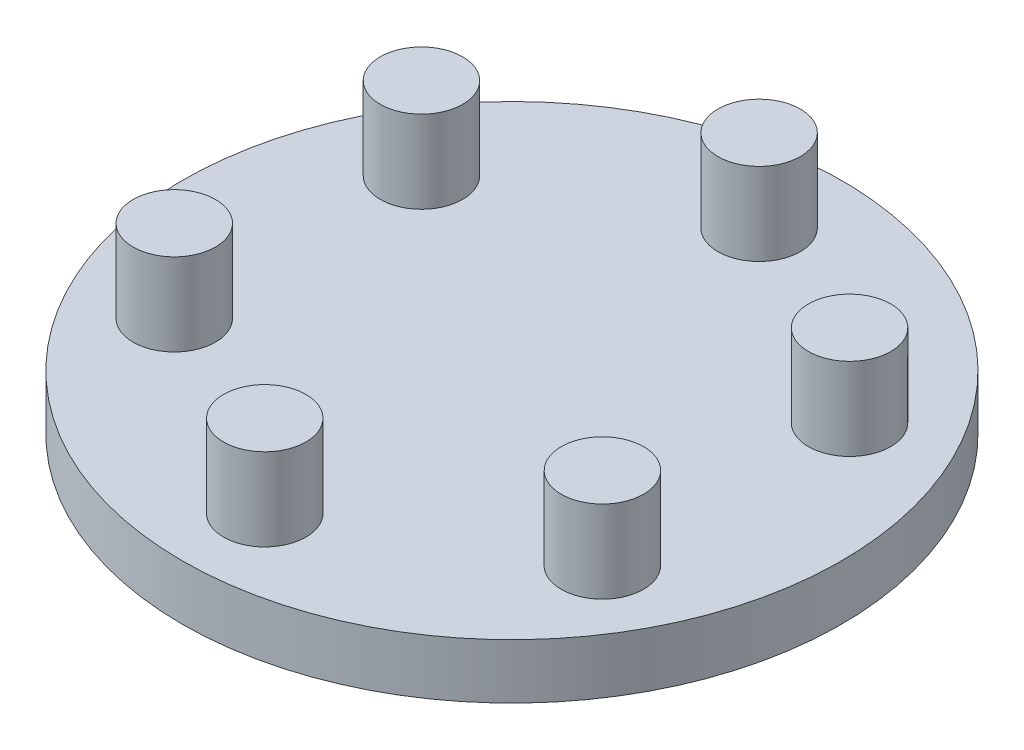
ISO-10303-21;
HEADER;
FILE_DESCRIPTION(('STEP AP214'),'2;1');
FILE_NAME('part.step','',(''),(''),'','','');
FILE_SCHEMA(('AUTOMOTIVE_DESIGN { 1 0 10303 214 1 1 1 1 }'));
ENDSEC;
DATA;
#1=APPLICATION_CONTEXT('core data for automotive mechanical design processes');
#2=APPLICATION_PROTOCOL_DEFINITION('international standard','automotive_design',2000,#1);
#3=PRODUCT_CONTEXT('',#1,'mechanical');
#4=PRODUCT('Part','Part','',(#3));
#5=PRODUCT_RELATED_PRODUCT_CATEGORY('part','',(#4));
#6=PRODUCT_DEFINITION_FORMATION('','',#4);
#7=PRODUCT_DEFINITION_CONTEXT('part definition',#1,'design');
#8=PRODUCT_DEFINITION('design','',#6,#7);
#9=PRODUCT_DEFINITION_SHAPE('','',#8);
#10=(LENGTH_UNIT() NAMED_UNIT(*) SI_UNIT(.MILLI.,.METRE.));
#11=(NAMED_UNIT(*) PLANE_ANGLE_UNIT() SI_UNIT($,.RADIAN.));
#12=(NAMED_UNIT(*) SI_UNIT($,.STERADIAN.) SOLID_ANGLE_UNIT());
#13=UNCERTAINTY_MEASURE_WITH_UNIT(LENGTH_MEASURE(1.E-05),#10,'distance_accuracy_value','');
#14=(GEOMETRIC_REPRESENTATION_CONTEXT(3) GLOBAL_UNCERTAINTY_ASSIGNED_CONTEXT((#13)) GLOBAL_UNIT_ASSIGNED_CONTEXT((#10,
#11,#12)) REPRESENTATION_CONTEXT('',''));
#15=CARTESIAN_POINT('',(0.,0.,0.));
#16=DIRECTION('',(0.,0.,1.));
#17=DIRECTION('',(1.,0.,0.));
#18=AXIS2_PLACEMENT_3D('',#15,#16,#17);
#19=CARTESIAN_POINT('',(0.,10.,0.));
#20=DIRECTION('',(0.,-1.,0.));
#21=DIRECTION('',(0.,0.,-1.));
#22=AXIS2_PLACEMENT_3D('',#19,#20,#21);
#23=CYLINDRICAL_SURFACE('',#22,60.);
#24=CARTESIAN_POINT('',(0.,10.,0.));
#25=DIRECTION('',(0.,1.,0.));
#26=DIRECTION('',(0.,0.,1.));
#27=AXIS2_PLACEMENT_3D('',#24,#25,#26);
#28=CIRCLE('',#27,60.);
#29=CARTESIAN_POINT('',(0.,10.,60.));
#30=VERTEX_POINT('',#29);
#31=EDGE_CURVE('E10',#30,#30,#28,.T.);
#32=ORIENTED_EDGE('',*,*,#31,.F.);
#33=EDGE_LOOP('',(#32));
#34=FACE_BOUND('',#33,.T.);
#35=CARTESIAN_POINT('',(0.,0.,0.));
#36=DIRECTION('',(0.,1.,0.));
#37=DIRECTION('',(0.,0.,1.));
#38=AXIS2_PLACEMENT_3D('',#35,#36,#37);
#39=CIRCLE('',#38,60.);
#40=CARTESIAN_POINT('',(0.,0.,60.));
#41=VERTEX_POINT('',#40);
#42=EDGE_CURVE('E40',#41,#41,#39,.T.);
#43=ORIENTED_EDGE('',*,*,#42,.T.);
#44=EDGE_LOOP('',(#43));
#45=FACE_BOUND('',#44,.T.);
#46=ADVANCED_FACE('F37',(#34,#45),#23,.T.);
#47=CARTESIAN_POINT('',(0.,10.,0.));
#48=DIRECTION('',(0.,1.,0.));
#49=DIRECTION('',(0.,0.,1.));
#50=AXIS2_PLACEMENT_3D('',#47,#48,#49);
#51=PLANE('',#50);
#52=CARTESIAN_POINT('',(38.9711431702996,10.,-22.5000000000003));
#53=DIRECTION('',(0.,1.,0.));
#54=DIRECTION('',(-0.866025403784435,0.,0.500000000000007));
#55=AXIS2_PLACEMENT_3D('',#52,#53,#54);
#56=CIRCLE('',#55,7.5);
#57=CARTESIAN_POINT('',(32.4759526419163,10.,-18.7500000000003));
#58=VERTEX_POINT('',#57);
#59=EDGE_CURVE('E91',#58,#58,#56,.T.);
#60=ORIENTED_EDGE('',*,*,#59,.F.);
#61=EDGE_LOOP('',(#60));
#62=FACE_BOUND('',#61,.T.);
#63=CARTESIAN_POINT('',(38.9711431702999,10.,22.4999999999997));
#64=DIRECTION('',(0.,1.,0.));
#65=DIRECTION('',(-0.866025403784442,0.,-0.499999999999994));
#66=AXIS2_PLACEMENT_3D('',#63,#64,#65);
#67=CIRCLE('',#66,7.5);
#68=CARTESIAN_POINT('',(32.4759526419166,10.,18.7499999999998));
#69=VERTEX_POINT('',#68);
#70=EDGE_CURVE('E83',#69,#69,#67,.T.);
#71=ORIENTED_EDGE('',*,*,#70,.F.);
#72=EDGE_LOOP('',(#71));
#73=FACE_BOUND('',#72,.T.);
#74=CARTESIAN_POINT('',(2.34297262722871E-13,10.,45.));
#75=DIRECTION('',(0.,1.,0.));
#76=DIRECTION('',(0.,0.,-1.));
#77=AXIS2_PLACEMENT_3D('',#74,#75,#76);
#78=CIRCLE('',#77,7.5);
#79=CARTESIAN_POINT('',(1.95247718935726E-13,10.,37.5));
#80=VERTEX_POINT('',#79);
#81=EDGE_CURVE('E75',#80,#80,#78,.T.);
#82=ORIENTED_EDGE('',*,*,#81,.F.);
#83=EDGE_LOOP('',(#82));
#84=FACE_BOUND('',#83,.T.);
#85=CARTESIAN_POINT('',(-38.9711431702997,10.,22.5000000000001));
#86=DIRECTION('',(0.,1.,0.));
#87=DIRECTION('',(0.866025403784437,0.,-0.500000000000003));
#88=AXIS2_PLACEMENT_3D('',#85,#86,#87);
#89=CIRCLE('',#88,7.5);
#90=CARTESIAN_POINT('',(-32.4759526419164,10.,18.7500000000001));
#91=VERTEX_POINT('',#90);
#92=EDGE_CURVE('E67',#91,#91,#89,.T.);
#93=ORIENTED_EDGE('',*,*,#92,.F.);
#94=EDGE_LOOP('',(#93));
#95=FACE_BOUND('',#94,.T.);
#96=CARTESIAN_POINT('',(-38.9711431702998,10.,-22.4999999999999));
#97=DIRECTION('',(0.,1.,0.));
#98=DIRECTION('',(0.866025403784439,0.,0.499999999999999));
#99=AXIS2_PLACEMENT_3D('',#96,#97,#98);
#100=CIRCLE('',#99,7.5);
#101=CARTESIAN_POINT('',(-32.4759526419165,10.,-18.7499999999999));
#102=VERTEX_POINT('',#101);
#103=EDGE_CURVE('E59',#102,#102,#100,.T.);
#104=ORIENTED_EDGE('',*,*,#103,.F.);
#105=EDGE_LOOP('',(#104));
#106=FACE_BOUND('',#105,.T.);
#107=CARTESIAN_POINT('',(0.,10.,-45.));
#108=DIRECTION('',(0.,1.,0.));
#109=DIRECTION('',(0.,0.,1.));
#110=AXIS2_PLACEMENT_3D('',#107,#108,#109);
#111=CIRCLE('',#110,7.5);
#112=CARTESIAN_POINT('',(0.,10.,-37.5));
#113=VERTEX_POINT('',#112);
#114=EDGE_CURVE('E51',#113,#113,#111,.T.);
#115=ORIENTED_EDGE('',*,*,#114,.F.);
#116=EDGE_LOOP('',(#115));
#117=FACE_BOUND('',#116,.T.);
#118=ORIENTED_EDGE('',*,*,#31,.T.);
#119=EDGE_LOOP('',(#118));
#120=FACE_BOUND('',#119,.T.);
#121=ADVANCED_FACE('F108',(#62,#73,#84,#95,#106,#117,#120),#51,.T.);
#122=CARTESIAN_POINT('',(0.,0.,0.));
#123=DIRECTION('',(0.,1.,0.));
#124=DIRECTION('',(0.,0.,1.));
#125=AXIS2_PLACEMENT_3D('',#122,#123,#124);
#126=PLANE('',#125);
#127=ORIENTED_EDGE('',*,*,#42,.F.);
#128=EDGE_LOOP('',(#127));
#129=FACE_BOUND('',#128,.T.);
#130=ADVANCED_FACE('F111',(#129),#126,.F.);
#131=CARTESIAN_POINT('',(0.,25.,-45.));
#132=DIRECTION('',(0.,-1.,0.));
#133=DIRECTION('',(0.,0.,-1.));
#134=AXIS2_PLACEMENT_3D('',#131,#132,#133);
#135=CYLINDRICAL_SURFACE('',#134,7.5);
#136=CARTESIAN_POINT('',(0.,25.,-45.));
#137=DIRECTION('',(0.,1.,0.));
#138=DIRECTION('',(0.,0.,1.));
#139=AXIS2_PLACEMENT_3D('',#136,#137,#138);
#140=CIRCLE('',#139,7.5);
#141=CARTESIAN_POINT('',(0.,25.,-37.5));
#142=VERTEX_POINT('',#141);
#143=EDGE_CURVE('E49',#142,#142,#140,.T.);
#144=ORIENTED_EDGE('',*,*,#143,.F.);
#145=EDGE_LOOP('',(#144));
#146=FACE_BOUND('',#145,.T.);
#147=ORIENTED_EDGE('',*,*,#114,.T.);
#148=EDGE_LOOP('',(#147));
#149=FACE_BOUND('',#148,.T.);
#150=ADVANCED_FACE('F123',(#146,#149),#135,.T.);
#151=CARTESIAN_POINT('',(0.,25.,-45.));
#152=DIRECTION('',(0.,1.,0.));
#153=DIRECTION('',(0.,0.,1.));
#154=AXIS2_PLACEMENT_3D('',#151,#152,#153);
#155=PLANE('',#154);
#156=ORIENTED_EDGE('',*,*,#143,.T.);
#157=EDGE_LOOP('',(#156));
#158=FACE_BOUND('',#157,.T.);
#159=ADVANCED_FACE('F125',(#158),#155,.T.);
#160=CARTESIAN_POINT('',(-38.9711431702998,25.,-22.4999999999999));
#161=DIRECTION('',(0.,-1.,0.));
#162=DIRECTION('',(0.,0.,-1.));
#163=AXIS2_PLACEMENT_3D('',#160,#161,#162);
#164=CYLINDRICAL_SURFACE('',#163,7.5);
#165=CARTESIAN_POINT('',(-38.9711431702998,25.,-22.4999999999999));
#166=DIRECTION('',(0.,1.,0.));
#167=DIRECTION('',(0.866025403784439,0.,0.499999999999999));
#168=AXIS2_PLACEMENT_3D('',#165,#166,#167);
#169=CIRCLE('',#168,7.5);
#170=CARTESIAN_POINT('',(-32.4759526419165,25.,-18.7499999999999));
#171=VERTEX_POINT('',#170);
#172=EDGE_CURVE('E55',#171,#171,#169,.T.);
#173=ORIENTED_EDGE('',*,*,#172,.F.);
#174=EDGE_LOOP('',(#173));
#175=FACE_BOUND('',#174,.T.);
#176=ORIENTED_EDGE('',*,*,#103,.T.);
#177=EDGE_LOOP('',(#176));
#178=FACE_BOUND('',#177,.T.);
#179=ADVANCED_FACE('F132',(#175,#178),#164,.T.);
#180=CARTESIAN_POINT('',(-38.9711431702998,25.,-22.4999999999999));
#181=DIRECTION('',(0.,1.,0.));
#182=DIRECTION('',(0.866025403784439,0.,0.499999999999999));
#183=AXIS2_PLACEMENT_3D('',#180,#181,#182);
#184=PLANE('',#183);
#185=ORIENTED_EDGE('',*,*,#172,.T.);
#186=EDGE_LOOP('',(#185));
#187=FACE_BOUND('',#186,.T.);
#188=ADVANCED_FACE('F170',(#187),#184,.T.);
#189=CARTESIAN_POINT('',(-38.9711431702997,25.,22.5000000000001));
#190=DIRECTION('',(0.,-1.,0.));
#191=DIRECTION('',(0.,0.,-1.));
#192=AXIS2_PLACEMENT_3D('',#189,#190,#191);
#193=CYLINDRICAL_SURFACE('',#192,7.5);
#194=CARTESIAN_POINT('',(-38.9711431702997,25.,22.5000000000001));
#195=DIRECTION('',(0.,1.,0.));
#196=DIRECTION('',(0.866025403784437,0.,-0.500000000000003));
#197=AXIS2_PLACEMENT_3D('',#194,#195,#196);
#198=CIRCLE('',#197,7.5);
#199=CARTESIAN_POINT('',(-32.4759526419164,25.,18.7500000000001));
#200=VERTEX_POINT('',#199);
#201=EDGE_CURVE('E63',#200,#200,#198,.T.);
#202=ORIENTED_EDGE('',*,*,#201,.F.);
#203=EDGE_LOOP('',(#202));
#204=FACE_BOUND('',#203,.T.);
#205=ORIENTED_EDGE('',*,*,#92,.T.);
#206=EDGE_LOOP('',(#205));
#207=FACE_BOUND('',#206,.T.);
#208=ADVANCED_FACE('F177',(#204,#207),#193,.T.);
#209=CARTESIAN_POINT('',(-38.9711431702997,25.,22.5000000000001));
#210=DIRECTION('',(0.,1.,0.));
#211=DIRECTION('',(0.866025403784437,0.,-0.500000000000003));
#212=AXIS2_PLACEMENT_3D('',#209,#210,#211);
#213=PLANE('',#212);
#214=ORIENTED_EDGE('',*,*,#201,.T.);
#215=EDGE_LOOP('',(#214));
#216=FACE_BOUND('',#215,.T.);
#217=ADVANCED_FACE('F185',(#216),#213,.T.);
#218=CARTESIAN_POINT('',(2.34297262722871E-13,25.,45.));
#219=DIRECTION('',(0.,-1.,0.));
#220=DIRECTION('',(0.,0.,-1.));
#221=AXIS2_PLACEMENT_3D('',#218,#219,#220);
#222=CYLINDRICAL_SURFACE('',#221,7.5);
#223=CARTESIAN_POINT('',(2.34297262722871E-13,25.,45.));
#224=DIRECTION('',(0.,1.,0.));
#225=DIRECTION('',(0.,0.,-1.));
#226=AXIS2_PLACEMENT_3D('',#223,#224,#225);
#227=CIRCLE('',#226,7.5);
#228=CARTESIAN_POINT('',(1.95247718935726E-13,25.,37.5));
#229=VERTEX_POINT('',#228);
#230=EDGE_CURVE('E71',#229,#229,#227,.T.);
#231=ORIENTED_EDGE('',*,*,#230,.F.);
#232=EDGE_LOOP('',(#231));
#233=FACE_BOUND('',#232,.T.);
#234=ORIENTED_EDGE('',*,*,#81,.T.);
#235=EDGE_LOOP('',(#234));
#236=FACE_BOUND('',#235,.T.);
#237=ADVANCED_FACE('F193',(#233,#236),#222,.T.);
#238=CARTESIAN_POINT('',(2.34297262722871E-13,25.,45.));
#239=DIRECTION('',(0.,1.,0.));
#240=DIRECTION('',(0.,0.,-1.));
#241=AXIS2_PLACEMENT_3D('',#238,#239,#240);
#242=PLANE('',#241);
#243=ORIENTED_EDGE('',*,*,#230,.T.);
#244=EDGE_LOOP('',(#243));
#245=FACE_BOUND('',#244,.T.);
#246=ADVANCED_FACE('F201',(#245),#242,.T.);
#247=CARTESIAN_POINT('',(38.9711431702999,25.,22.4999999999997));
#248=DIRECTION('',(0.,-1.,0.));
#249=DIRECTION('',(0.,0.,-1.));
#250=AXIS2_PLACEMENT_3D('',#247,#248,#249);
#251=CYLINDRICAL_SURFACE('',#250,7.5);
#252=CARTESIAN_POINT('',(38.9711431702999,25.,22.4999999999997));
#253=DIRECTION('',(0.,1.,0.));
#254=DIRECTION('',(-0.866025403784442,0.,-0.499999999999994));
#255=AXIS2_PLACEMENT_3D('',#252,#253,#254);
#256=CIRCLE('',#255,7.5);
#257=CARTESIAN_POINT('',(32.4759526419166,25.,18.7499999999998));
#258=VERTEX_POINT('',#257);
#259=EDGE_CURVE('E79',#258,#258,#256,.T.);
#260=ORIENTED_EDGE('',*,*,#259,.F.);
#261=EDGE_LOOP('',(#260));
#262=FACE_BOUND('',#261,.T.);
#263=ORIENTED_EDGE('',*,*,#70,.T.);
#264=EDGE_LOOP('',(#263));
#265=FACE_BOUND('',#264,.T.);
#266=ADVANCED_FACE('F209',(#262,#265),#251,.T.);
#267=CARTESIAN_POINT('',(38.9711431702999,25.,22.4999999999997));
#268=DIRECTION('',(0.,1.,0.));
#269=DIRECTION('',(-0.866025403784442,0.,-0.499999999999994));
#270=AXIS2_PLACEMENT_3D('',#267,#268,#269);
#271=PLANE('',#270);
#272=ORIENTED_EDGE('',*,*,#259,.T.);
#273=EDGE_LOOP('',(#272));
#274=FACE_BOUND('',#273,.T.);
#275=ADVANCED_FACE('F104',(#274),#271,.T.);
#276=CARTESIAN_POINT('',(38.9711431702996,25.,-22.5000000000003));
#277=DIRECTION('',(0.,-1.,0.));
#278=DIRECTION('',(0.,0.,-1.));
#279=AXIS2_PLACEMENT_3D('',#276,#277,#278);
#280=CYLINDRICAL_SURFACE('',#279,7.5);
#281=CARTESIAN_POINT('',(38.9711431702996,25.,-22.5000000000003));
#282=DIRECTION('',(0.,1.,0.));
#283=DIRECTION('',(-0.866025403784435,0.,0.500000000000007));
#284=AXIS2_PLACEMENT_3D('',#281,#282,#283);
#285=CIRCLE('',#284,7.5);
#286=CARTESIAN_POINT('',(32.4759526419163,25.,-18.7500000000003));
#287=VERTEX_POINT('',#286);
#288=EDGE_CURVE('E87',#287,#287,#285,.T.);
#289=ORIENTED_EDGE('',*,*,#288,.F.);
#290=EDGE_LOOP('',(#289));
#291=FACE_BOUND('',#290,.T.);
#292=ORIENTED_EDGE('',*,*,#59,.T.);
#293=EDGE_LOOP('',(#292));
#294=FACE_BOUND('',#293,.T.);
#295=ADVANCED_FACE('F101',(#291,#294),#280,.T.);
#296=CARTESIAN_POINT('',(38.9711431702996,25.,-22.5000000000003));
#297=DIRECTION('',(0.,1.,0.));
#298=DIRECTION('',(-0.866025403784435,0.,0.500000000000007));
#299=AXIS2_PLACEMENT_3D('',#296,#297,#298);
#300=PLANE('',#299);
#301=ORIENTED_EDGE('',*,*,#288,.T.);
#302=EDGE_LOOP('',(#301));
#303=FACE_BOUND('',#302,.T.);
#304=ADVANCED_FACE('F99',(#303),#300,.T.);
#305=CLOSED_SHELL('',(#46,#121,#130,#150,#159,#179,#188,#208,#217,#237,#246,#266,#275,#295,#304));
#306=MANIFOLD_SOLID_BREP('B2',#305);
#307=ADVANCED_BREP_SHAPE_REPRESENTATION('',(#18,#306),#14);
#308=SHAPE_DEFINITION_REPRESENTATION(#9,#307);
ENDSEC;
END-ISO-10303-21;
